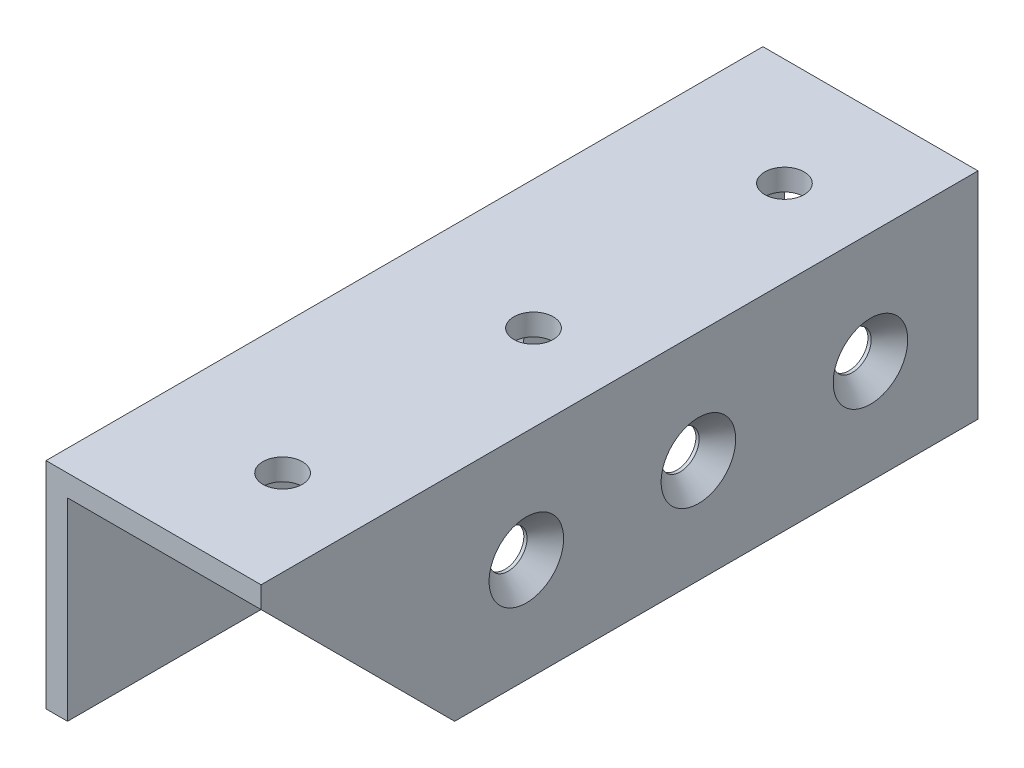
ISO-10303-21;
HEADER;
FILE_DESCRIPTION(('STEP AP214'),'2;1');
FILE_NAME('part.step','',(''),(''),'','','');
FILE_SCHEMA(('AUTOMOTIVE_DESIGN { 1 0 10303 214 1 1 1 1 }'));
ENDSEC;
DATA;
#1=APPLICATION_CONTEXT('core data for automotive mechanical design processes');
#2=APPLICATION_PROTOCOL_DEFINITION('international standard','automotive_design',2000,#1);
#3=PRODUCT_CONTEXT('',#1,'mechanical');
#4=PRODUCT('Part','Part','',(#3));
#5=PRODUCT_RELATED_PRODUCT_CATEGORY('part','',(#4));
#6=PRODUCT_DEFINITION_FORMATION('','',#4);
#7=PRODUCT_DEFINITION_CONTEXT('part definition',#1,'design');
#8=PRODUCT_DEFINITION('design','',#6,#7);
#9=PRODUCT_DEFINITION_SHAPE('','',#8);
#10=(LENGTH_UNIT() NAMED_UNIT(*) SI_UNIT(.MILLI.,.METRE.));
#11=(NAMED_UNIT(*) PLANE_ANGLE_UNIT() SI_UNIT($,.RADIAN.));
#12=(NAMED_UNIT(*) SI_UNIT($,.STERADIAN.) SOLID_ANGLE_UNIT());
#13=UNCERTAINTY_MEASURE_WITH_UNIT(LENGTH_MEASURE(1.E-05),#10,'distance_accuracy_value','');
#14=(GEOMETRIC_REPRESENTATION_CONTEXT(3) GLOBAL_UNCERTAINTY_ASSIGNED_CONTEXT((#13)) GLOBAL_UNIT_ASSIGNED_CONTEXT((#10,
#11,#12)) REPRESENTATION_CONTEXT('',''));
#15=CARTESIAN_POINT('',(0.,0.,0.));
#16=DIRECTION('',(0.,0.,1.));
#17=DIRECTION('',(1.,0.,0.));
#18=AXIS2_PLACEMENT_3D('',#15,#16,#17);
#19=CARTESIAN_POINT('',(3.,0.,100.));
#20=DIRECTION('',(0.,1.,0.));
#21=DIRECTION('',(-1.,0.,0.));
#22=AXIS2_PLACEMENT_3D('',#19,#20,#21);
#23=PLANE('',#22);
#24=DIRECTION('',(1.,0.,0.));
#25=VECTOR('',#24,1.);
#26=CARTESIAN_POINT('',(3.,0.,0.));
#27=LINE('',#26,#25);
#28=CARTESIAN_POINT('',(0.,0.,0.));
#29=VERTEX_POINT('',#28);
#30=CARTESIAN_POINT('',(3.,0.,0.));
#31=VERTEX_POINT('',#30);
#32=EDGE_CURVE('E136',#29,#31,#27,.T.);
#33=ORIENTED_EDGE('',*,*,#32,.T.);
#34=DIRECTION('',(0.,0.,-1.));
#35=VECTOR('',#34,1.);
#36=CARTESIAN_POINT('',(3.,0.,100.));
#37=LINE('',#36,#35);
#38=CARTESIAN_POINT('',(3.,0.,100.));
#39=VERTEX_POINT('',#38);
#40=EDGE_CURVE('E116',#39,#31,#37,.T.);
#41=ORIENTED_EDGE('',*,*,#40,.F.);
#42=DIRECTION('',(1.,0.,0.));
#43=VECTOR('',#42,1.);
#44=CARTESIAN_POINT('',(3.,0.,100.));
#45=LINE('',#44,#43);
#46=CARTESIAN_POINT('',(0.,0.,100.));
#47=VERTEX_POINT('',#46);
#48=EDGE_CURVE('E124',#47,#39,#45,.T.);
#49=ORIENTED_EDGE('',*,*,#48,.F.);
#50=DIRECTION('',(0.,0.,-1.));
#51=VECTOR('',#50,1.);
#52=CARTESIAN_POINT('',(0.,0.,100.));
#53=LINE('',#52,#51);
#54=EDGE_CURVE('E157',#47,#29,#53,.T.);
#55=ORIENTED_EDGE('',*,*,#54,.T.);
#56=EDGE_LOOP('',(#33,#41,#49,#55));
#57=FACE_BOUND('',#56,.T.);
#58=ADVANCED_FACE('F45',(#57),#23,.F.);
#59=CARTESIAN_POINT('',(3.,27.,100.));
#60=DIRECTION('',(-1.,0.,0.));
#61=DIRECTION('',(0.,-1.,0.));
#62=AXIS2_PLACEMENT_3D('',#59,#60,#61);
#63=PLANE('',#62);
#64=CARTESIAN_POINT('',(3.,14.5,15.));
#65=DIRECTION('',(-1.,0.,0.));
#66=DIRECTION('',(0.,-1.,0.));
#67=AXIS2_PLACEMENT_3D('',#64,#65,#66);
#68=CIRCLE('',#67,2.64999999999999);
#69=CARTESIAN_POINT('',(3.,11.85,15.));
#70=VERTEX_POINT('',#69);
#71=EDGE_CURVE('E229',#70,#70,#68,.T.);
#72=ORIENTED_EDGE('',*,*,#71,.T.);
#73=EDGE_LOOP('',(#72));
#74=FACE_BOUND('',#73,.T.);
#75=CARTESIAN_POINT('',(3.,14.5,63.));
#76=DIRECTION('',(-1.,0.,0.));
#77=DIRECTION('',(0.,-1.,0.));
#78=AXIS2_PLACEMENT_3D('',#75,#76,#77);
#79=CIRCLE('',#78,2.64999999999999);
#80=CARTESIAN_POINT('',(3.,11.85,63.));
#81=VERTEX_POINT('',#80);
#82=EDGE_CURVE('E214',#81,#81,#79,.T.);
#83=ORIENTED_EDGE('',*,*,#82,.T.);
#84=EDGE_LOOP('',(#83));
#85=FACE_BOUND('',#84,.T.);
#86=CARTESIAN_POINT('',(3.,14.5,39.));
#87=DIRECTION('',(-1.,0.,0.));
#88=DIRECTION('',(0.,-1.,0.));
#89=AXIS2_PLACEMENT_3D('',#86,#87,#88);
#90=CIRCLE('',#89,2.64999999999999);
#91=CARTESIAN_POINT('',(3.,11.85,39.));
#92=VERTEX_POINT('',#91);
#93=EDGE_CURVE('E199',#92,#92,#90,.T.);
#94=ORIENTED_EDGE('',*,*,#93,.T.);
#95=EDGE_LOOP('',(#94));
#96=FACE_BOUND('',#95,.T.);
#97=DIRECTION('',(0.,1.,0.));
#98=VECTOR('',#97,1.);
#99=CARTESIAN_POINT('',(3.,27.,0.));
#100=LINE('',#99,#98);
#101=CARTESIAN_POINT('',(3.,27.,0.));
#102=VERTEX_POINT('',#101);
#103=EDGE_CURVE('E172',#31,#102,#100,.T.);
#104=ORIENTED_EDGE('',*,*,#103,.T.);
#105=DIRECTION('',(0.,0.,-1.));
#106=VECTOR('',#105,1.);
#107=CARTESIAN_POINT('',(3.,27.,100.));
#108=LINE('',#107,#106);
#109=CARTESIAN_POINT('',(3.,27.,100.));
#110=VERTEX_POINT('',#109);
#111=EDGE_CURVE('E119',#110,#102,#108,.T.);
#112=ORIENTED_EDGE('',*,*,#111,.F.);
#113=DIRECTION('',(0.,1.,0.));
#114=VECTOR('',#113,1.);
#115=CARTESIAN_POINT('',(3.,27.,100.));
#116=LINE('',#115,#114);
#117=EDGE_CURVE('E112',#39,#110,#116,.T.);
#118=ORIENTED_EDGE('',*,*,#117,.F.);
#119=ORIENTED_EDGE('',*,*,#40,.T.);
#120=EDGE_LOOP('',(#104,#112,#118,#119));
#121=FACE_BOUND('',#120,.T.);
#122=ADVANCED_FACE('F114',(#74,#85,#96,#121),#63,.F.);
#123=CARTESIAN_POINT('',(27.,27.,100.));
#124=DIRECTION('',(0.,1.,0.));
#125=DIRECTION('',(-1.,0.,0.));
#126=AXIS2_PLACEMENT_3D('',#123,#124,#125);
#127=PLANE('',#126);
#128=CARTESIAN_POINT('',(18.,27.,50.));
#129=DIRECTION('',(0.,1.,0.));
#130=DIRECTION('',(-1.,0.,0.));
#131=AXIS2_PLACEMENT_3D('',#128,#129,#130);
#132=CIRCLE('',#131,2.74999999999999);
#133=CARTESIAN_POINT('',(15.25,27.,50.));
#134=VERTEX_POINT('',#133);
#135=EDGE_CURVE('E193',#134,#134,#132,.T.);
#136=ORIENTED_EDGE('',*,*,#135,.T.);
#137=EDGE_LOOP('',(#136));
#138=FACE_BOUND('',#137,.T.);
#139=CARTESIAN_POINT('',(18.,27.,15.));
#140=DIRECTION('',(0.,1.,0.));
#141=DIRECTION('',(-1.,0.,0.));
#142=AXIS2_PLACEMENT_3D('',#139,#140,#141);
#143=CIRCLE('',#142,2.74999999999999);
#144=CARTESIAN_POINT('',(15.25,27.,15.));
#145=VERTEX_POINT('',#144);
#146=EDGE_CURVE('E187',#145,#145,#143,.T.);
#147=ORIENTED_EDGE('',*,*,#146,.T.);
#148=EDGE_LOOP('',(#147));
#149=FACE_BOUND('',#148,.T.);
#150=CARTESIAN_POINT('',(18.,27.,85.));
#151=DIRECTION('',(0.,1.,0.));
#152=DIRECTION('',(-1.,0.,0.));
#153=AXIS2_PLACEMENT_3D('',#150,#151,#152);
#154=CIRCLE('',#153,2.74999999999999);
#155=CARTESIAN_POINT('',(15.25,27.,85.));
#156=VERTEX_POINT('',#155);
#157=EDGE_CURVE('E175',#156,#156,#154,.T.);
#158=ORIENTED_EDGE('',*,*,#157,.T.);
#159=EDGE_LOOP('',(#158));
#160=FACE_BOUND('',#159,.T.);
#161=DIRECTION('',(1.,0.,0.));
#162=VECTOR('',#161,1.);
#163=CARTESIAN_POINT('',(27.,27.,0.));
#164=LINE('',#163,#162);
#165=CARTESIAN_POINT('',(27.,27.,0.));
#166=VERTEX_POINT('',#165);
#167=EDGE_CURVE('E170',#102,#166,#164,.T.);
#168=ORIENTED_EDGE('',*,*,#167,.T.);
#169=DIRECTION('',(0.,0.,-1.));
#170=VECTOR('',#169,1.);
#171=CARTESIAN_POINT('',(27.,27.,100.));
#172=LINE('',#171,#170);
#173=CARTESIAN_POINT('',(27.,27.,100.));
#174=VERTEX_POINT('',#173);
#175=EDGE_CURVE('E141',#174,#166,#172,.T.);
#176=ORIENTED_EDGE('',*,*,#175,.F.);
#177=DIRECTION('',(1.,0.,0.));
#178=VECTOR('',#177,1.);
#179=CARTESIAN_POINT('',(27.,27.,100.));
#180=LINE('',#179,#178);
#181=EDGE_CURVE('E123',#110,#174,#180,.T.);
#182=ORIENTED_EDGE('',*,*,#181,.F.);
#183=ORIENTED_EDGE('',*,*,#111,.T.);
#184=EDGE_LOOP('',(#168,#176,#182,#183));
#185=FACE_BOUND('',#184,.T.);
#186=ADVANCED_FACE('F277',(#138,#149,#160,#185),#127,.F.);
#187=CARTESIAN_POINT('',(27.,0.,100.));
#188=DIRECTION('',(1.,0.,0.));
#189=DIRECTION('',(0.,0.,-1.));
#190=AXIS2_PLACEMENT_3D('',#187,#188,#189);
#191=PLANE('',#190);
#192=CARTESIAN_POINT('',(27.,14.5,15.));
#193=DIRECTION('',(1.,0.,0.));
#194=DIRECTION('',(0.,0.,-1.));
#195=AXIS2_PLACEMENT_3D('',#192,#193,#194);
#196=CIRCLE('',#195,2.64999999999999);
#197=CARTESIAN_POINT('',(27.,14.5,12.35));
#198=VERTEX_POINT('',#197);
#199=EDGE_CURVE('E232',#198,#198,#196,.T.);
#200=ORIENTED_EDGE('',*,*,#199,.T.);
#201=EDGE_LOOP('',(#200));
#202=FACE_BOUND('',#201,.T.);
#203=CARTESIAN_POINT('',(27.,14.5,63.));
#204=DIRECTION('',(1.,0.,0.));
#205=DIRECTION('',(0.,0.,-1.));
#206=AXIS2_PLACEMENT_3D('',#203,#204,#205);
#207=CIRCLE('',#206,2.64999999999999);
#208=CARTESIAN_POINT('',(27.,14.5,60.35));
#209=VERTEX_POINT('',#208);
#210=EDGE_CURVE('E217',#209,#209,#207,.T.);
#211=ORIENTED_EDGE('',*,*,#210,.T.);
#212=EDGE_LOOP('',(#211));
#213=FACE_BOUND('',#212,.T.);
#214=CARTESIAN_POINT('',(27.,14.5,39.));
#215=DIRECTION('',(1.,0.,0.));
#216=DIRECTION('',(0.,0.,-1.));
#217=AXIS2_PLACEMENT_3D('',#214,#215,#216);
#218=CIRCLE('',#217,2.64999999999999);
#219=CARTESIAN_POINT('',(27.,14.5,36.35));
#220=VERTEX_POINT('',#219);
#221=EDGE_CURVE('E202',#220,#220,#218,.T.);
#222=ORIENTED_EDGE('',*,*,#221,.T.);
#223=EDGE_LOOP('',(#222));
#224=FACE_BOUND('',#223,.T.);
#225=DIRECTION('',(0.,0.,-1.));
#226=VECTOR('',#225,1.);
#227=CARTESIAN_POINT('',(27.,0.,100.));
#228=LINE('',#227,#226);
#229=CARTESIAN_POINT('',(27.,0.,72.9999999999999));
#230=VERTEX_POINT('',#229);
#231=CARTESIAN_POINT('',(27.,0.,0.));
#232=VERTEX_POINT('',#231);
#233=EDGE_CURVE('E147',#230,#232,#228,.T.);
#234=ORIENTED_EDGE('',*,*,#233,.F.);
#235=DIRECTION('',(0.,-0.707106781186546,-0.707106781186549));
#236=VECTOR('',#235,1.);
#237=CARTESIAN_POINT('',(27.,27.,100.));
#238=LINE('',#237,#236);
#239=EDGE_CURVE('E11',#230,#174,#238,.F.);
#240=ORIENTED_EDGE('',*,*,#239,.T.);
#241=ORIENTED_EDGE('',*,*,#175,.T.);
#242=DIRECTION('',(0.,-1.,0.));
#243=VECTOR('',#242,1.);
#244=CARTESIAN_POINT('',(27.,0.,0.));
#245=LINE('',#244,#243);
#246=EDGE_CURVE('E167',#166,#232,#245,.T.);
#247=ORIENTED_EDGE('',*,*,#246,.T.);
#248=EDGE_LOOP('',(#234,#240,#241,#247));
#249=FACE_BOUND('',#248,.T.);
#250=ADVANCED_FACE('F264',(#202,#213,#224,#249),#191,.F.);
#251=CARTESIAN_POINT('',(30.,0.,100.));
#252=DIRECTION('',(0.,1.,0.));
#253=DIRECTION('',(-1.,0.,0.));
#254=AXIS2_PLACEMENT_3D('',#251,#252,#253);
#255=PLANE('',#254);
#256=DIRECTION('',(0.,0.,-1.));
#257=VECTOR('',#256,1.);
#258=CARTESIAN_POINT('',(30.,0.,100.));
#259=LINE('',#258,#257);
#260=CARTESIAN_POINT('',(30.,0.,72.9999999999999));
#261=VERTEX_POINT('',#260);
#262=CARTESIAN_POINT('',(30.,0.,0.));
#263=VERTEX_POINT('',#262);
#264=EDGE_CURVE('E149',#261,#263,#259,.T.);
#265=ORIENTED_EDGE('',*,*,#264,.F.);
#266=DIRECTION('',(-1.,0.,0.));
#267=VECTOR('',#266,1.);
#268=CARTESIAN_POINT('',(30.,0.,72.9999999999999));
#269=LINE('',#268,#267);
#270=EDGE_CURVE('E54',#261,#230,#269,.T.);
#271=ORIENTED_EDGE('',*,*,#270,.T.);
#272=ORIENTED_EDGE('',*,*,#233,.T.);
#273=DIRECTION('',(1.,0.,0.));
#274=VECTOR('',#273,1.);
#275=CARTESIAN_POINT('',(30.,0.,0.));
#276=LINE('',#275,#274);
#277=EDGE_CURVE('E164',#232,#263,#276,.T.);
#278=ORIENTED_EDGE('',*,*,#277,.T.);
#279=EDGE_LOOP('',(#265,#271,#272,#278));
#280=FACE_BOUND('',#279,.T.);
#281=ADVANCED_FACE('F251',(#280),#255,.F.);
#282=CARTESIAN_POINT('',(30.,30.,100.));
#283=DIRECTION('',(-1.,0.,0.));
#284=DIRECTION('',(0.,-1.,0.));
#285=AXIS2_PLACEMENT_3D('',#282,#283,#284);
#286=PLANE('',#285);
#287=CARTESIAN_POINT('',(30.,14.5,15.));
#288=DIRECTION('',(1.,0.,0.));
#289=DIRECTION('',(0.,0.,-1.));
#290=AXIS2_PLACEMENT_3D('',#287,#288,#289);
#291=CIRCLE('',#290,5.2);
#292=CARTESIAN_POINT('',(30.,14.5,9.8));
#293=VERTEX_POINT('',#292);
#294=EDGE_CURVE('E241',#293,#293,#291,.T.);
#295=ORIENTED_EDGE('',*,*,#294,.F.);
#296=EDGE_LOOP('',(#295));
#297=FACE_BOUND('',#296,.T.);
#298=CARTESIAN_POINT('',(30.,14.5,63.));
#299=DIRECTION('',(1.,0.,0.));
#300=DIRECTION('',(0.,0.,-1.));
#301=AXIS2_PLACEMENT_3D('',#298,#299,#300);
#302=CIRCLE('',#301,5.2);
#303=CARTESIAN_POINT('',(30.,14.5,57.8));
#304=VERTEX_POINT('',#303);
#305=EDGE_CURVE('E226',#304,#304,#302,.T.);
#306=ORIENTED_EDGE('',*,*,#305,.F.);
#307=EDGE_LOOP('',(#306));
#308=FACE_BOUND('',#307,.T.);
#309=CARTESIAN_POINT('',(30.,14.5,39.));
#310=DIRECTION('',(1.,0.,0.));
#311=DIRECTION('',(0.,0.,-1.));
#312=AXIS2_PLACEMENT_3D('',#309,#310,#311);
#313=CIRCLE('',#312,5.2);
#314=CARTESIAN_POINT('',(30.,14.5,33.8));
#315=VERTEX_POINT('',#314);
#316=EDGE_CURVE('E211',#315,#315,#313,.T.);
#317=ORIENTED_EDGE('',*,*,#316,.F.);
#318=EDGE_LOOP('',(#317));
#319=FACE_BOUND('',#318,.T.);
#320=DIRECTION('',(0.,1.,0.));
#321=VECTOR('',#320,1.);
#322=CARTESIAN_POINT('',(30.,30.,100.));
#323=LINE('',#322,#321);
#324=CARTESIAN_POINT('',(30.,27.,100.));
#325=VERTEX_POINT('',#324);
#326=CARTESIAN_POINT('',(30.,30.,100.));
#327=VERTEX_POINT('',#326);
#328=EDGE_CURVE('E179',#325,#327,#323,.T.);
#329=ORIENTED_EDGE('',*,*,#328,.F.);
#330=DIRECTION('',(0.,0.707106781186546,0.707106781186549));
#331=VECTOR('',#330,1.);
#332=CARTESIAN_POINT('',(30.,27.,100.));
#333=LINE('',#332,#331);
#334=EDGE_CURVE('E68',#325,#261,#333,.F.);
#335=ORIENTED_EDGE('',*,*,#334,.T.);
#336=ORIENTED_EDGE('',*,*,#264,.T.);
#337=DIRECTION('',(0.,1.,0.));
#338=VECTOR('',#337,1.);
#339=CARTESIAN_POINT('',(30.,30.,0.));
#340=LINE('',#339,#338);
#341=CARTESIAN_POINT('',(30.,30.,0.));
#342=VERTEX_POINT('',#341);
#343=EDGE_CURVE('E162',#263,#342,#340,.T.);
#344=ORIENTED_EDGE('',*,*,#343,.T.);
#345=DIRECTION('',(0.,0.,-1.));
#346=VECTOR('',#345,1.);
#347=CARTESIAN_POINT('',(30.,30.,100.));
#348=LINE('',#347,#346);
#349=EDGE_CURVE('E151',#327,#342,#348,.T.);
#350=ORIENTED_EDGE('',*,*,#349,.F.);
#351=EDGE_LOOP('',(#329,#335,#336,#344,#350));
#352=FACE_BOUND('',#351,.T.);
#353=ADVANCED_FACE('F247',(#297,#308,#319,#352),#286,.F.);
#354=CARTESIAN_POINT('',(0.,30.,100.));
#355=DIRECTION('',(0.,-1.,0.));
#356=DIRECTION('',(0.,0.,-1.));
#357=AXIS2_PLACEMENT_3D('',#354,#355,#356);
#358=PLANE('',#357);
#359=CARTESIAN_POINT('',(18.,30.,50.));
#360=DIRECTION('',(0.,1.,0.));
#361=DIRECTION('',(0.,0.,1.));
#362=AXIS2_PLACEMENT_3D('',#359,#360,#361);
#363=CIRCLE('',#362,2.74999999999999);
#364=CARTESIAN_POINT('',(18.,30.,52.75));
#365=VERTEX_POINT('',#364);
#366=EDGE_CURVE('E196',#365,#365,#363,.T.);
#367=ORIENTED_EDGE('',*,*,#366,.F.);
#368=EDGE_LOOP('',(#367));
#369=FACE_BOUND('',#368,.T.);
#370=CARTESIAN_POINT('',(18.,30.,15.));
#371=DIRECTION('',(0.,1.,0.));
#372=DIRECTION('',(0.,0.,1.));
#373=AXIS2_PLACEMENT_3D('',#370,#371,#372);
#374=CIRCLE('',#373,2.74999999999999);
#375=CARTESIAN_POINT('',(18.,30.,17.75));
#376=VERTEX_POINT('',#375);
#377=EDGE_CURVE('E190',#376,#376,#374,.T.);
#378=ORIENTED_EDGE('',*,*,#377,.F.);
#379=EDGE_LOOP('',(#378));
#380=FACE_BOUND('',#379,.T.);
#381=CARTESIAN_POINT('',(18.,30.,85.));
#382=DIRECTION('',(0.,1.,0.));
#383=DIRECTION('',(0.,0.,1.));
#384=AXIS2_PLACEMENT_3D('',#381,#382,#383);
#385=CIRCLE('',#384,2.74999999999999);
#386=CARTESIAN_POINT('',(18.,30.,87.75));
#387=VERTEX_POINT('',#386);
#388=EDGE_CURVE('E184',#387,#387,#385,.T.);
#389=ORIENTED_EDGE('',*,*,#388,.F.);
#390=EDGE_LOOP('',(#389));
#391=FACE_BOUND('',#390,.T.);
#392=DIRECTION('',(-1.,0.,0.));
#393=VECTOR('',#392,1.);
#394=CARTESIAN_POINT('',(0.,30.,0.));
#395=LINE('',#394,#393);
#396=CARTESIAN_POINT('',(0.,30.,0.));
#397=VERTEX_POINT('',#396);
#398=EDGE_CURVE('E160',#342,#397,#395,.T.);
#399=ORIENTED_EDGE('',*,*,#398,.T.);
#400=DIRECTION('',(0.,0.,-1.));
#401=VECTOR('',#400,1.);
#402=CARTESIAN_POINT('',(0.,30.,100.));
#403=LINE('',#402,#401);
#404=CARTESIAN_POINT('',(0.,30.,100.));
#405=VERTEX_POINT('',#404);
#406=EDGE_CURVE('E154',#405,#397,#403,.T.);
#407=ORIENTED_EDGE('',*,*,#406,.F.);
#408=DIRECTION('',(-1.,0.,0.));
#409=VECTOR('',#408,1.);
#410=CARTESIAN_POINT('',(0.,30.,100.));
#411=LINE('',#410,#409);
#412=EDGE_CURVE('E177',#327,#405,#411,.T.);
#413=ORIENTED_EDGE('',*,*,#412,.F.);
#414=ORIENTED_EDGE('',*,*,#349,.T.);
#415=EDGE_LOOP('',(#399,#407,#413,#414));
#416=FACE_BOUND('',#415,.T.);
#417=ADVANCED_FACE('F250',(#369,#380,#391,#416),#358,.F.);
#418=CARTESIAN_POINT('',(0.,0.,100.));
#419=DIRECTION('',(1.,0.,0.));
#420=DIRECTION('',(0.,0.,-1.));
#421=AXIS2_PLACEMENT_3D('',#418,#419,#420);
#422=PLANE('',#421);
#423=CARTESIAN_POINT('',(0.,14.5,15.));
#424=DIRECTION('',(1.,0.,0.));
#425=DIRECTION('',(0.,0.,-1.));
#426=AXIS2_PLACEMENT_3D('',#423,#424,#425);
#427=CIRCLE('',#426,2.64999999999999);
#428=CARTESIAN_POINT('',(0.,14.5,12.35));
#429=VERTEX_POINT('',#428);
#430=EDGE_CURVE('E235',#429,#429,#427,.T.);
#431=ORIENTED_EDGE('',*,*,#430,.T.);
#432=EDGE_LOOP('',(#431));
#433=FACE_BOUND('',#432,.T.);
#434=CARTESIAN_POINT('',(0.,14.5,63.));
#435=DIRECTION('',(1.,0.,0.));
#436=DIRECTION('',(0.,0.,-1.));
#437=AXIS2_PLACEMENT_3D('',#434,#435,#436);
#438=CIRCLE('',#437,2.64999999999999);
#439=CARTESIAN_POINT('',(0.,14.5,60.35));
#440=VERTEX_POINT('',#439);
#441=EDGE_CURVE('E220',#440,#440,#438,.T.);
#442=ORIENTED_EDGE('',*,*,#441,.T.);
#443=EDGE_LOOP('',(#442));
#444=FACE_BOUND('',#443,.T.);
#445=CARTESIAN_POINT('',(0.,14.5,39.));
#446=DIRECTION('',(1.,0.,0.));
#447=DIRECTION('',(0.,0.,-1.));
#448=AXIS2_PLACEMENT_3D('',#445,#446,#447);
#449=CIRCLE('',#448,2.64999999999999);
#450=CARTESIAN_POINT('',(0.,14.5,36.35));
#451=VERTEX_POINT('',#450);
#452=EDGE_CURVE('E205',#451,#451,#449,.T.);
#453=ORIENTED_EDGE('',*,*,#452,.T.);
#454=EDGE_LOOP('',(#453));
#455=FACE_BOUND('',#454,.T.);
#456=DIRECTION('',(0.,-1.,0.));
#457=VECTOR('',#456,1.);
#458=CARTESIAN_POINT('',(0.,0.,0.));
#459=LINE('',#458,#457);
#460=EDGE_CURVE('E133',#397,#29,#459,.T.);
#461=ORIENTED_EDGE('',*,*,#460,.T.);
#462=ORIENTED_EDGE('',*,*,#54,.F.);
#463=DIRECTION('',(0.,-1.,0.));
#464=VECTOR('',#463,1.);
#465=CARTESIAN_POINT('',(0.,0.,100.));
#466=LINE('',#465,#464);
#467=EDGE_CURVE('E129',#405,#47,#466,.T.);
#468=ORIENTED_EDGE('',*,*,#467,.F.);
#469=ORIENTED_EDGE('',*,*,#406,.T.);
#470=EDGE_LOOP('',(#461,#462,#468,#469));
#471=FACE_BOUND('',#470,.T.);
#472=ADVANCED_FACE('F274',(#433,#444,#455,#471),#422,.F.);
#473=CARTESIAN_POINT('',(0.,0.,100.));
#474=DIRECTION('',(0.,0.,-1.));
#475=DIRECTION('',(-1.,0.,0.));
#476=AXIS2_PLACEMENT_3D('',#473,#474,#475);
#477=PLANE('',#476);
#478=ORIENTED_EDGE('',*,*,#181,.T.);
#479=DIRECTION('',(1.,0.,0.));
#480=VECTOR('',#479,1.);
#481=CARTESIAN_POINT('',(0.,27.,100.));
#482=LINE('',#481,#480);
#483=EDGE_CURVE('E137',#174,#325,#482,.T.);
#484=ORIENTED_EDGE('',*,*,#483,.T.);
#485=ORIENTED_EDGE('',*,*,#328,.T.);
#486=ORIENTED_EDGE('',*,*,#412,.T.);
#487=ORIENTED_EDGE('',*,*,#467,.T.);
#488=ORIENTED_EDGE('',*,*,#48,.T.);
#489=ORIENTED_EDGE('',*,*,#117,.T.);
#490=EDGE_LOOP('',(#478,#484,#485,#486,#487,#488,#489));
#491=FACE_BOUND('',#490,.T.);
#492=ADVANCED_FACE('F127',(#491),#477,.F.);
#493=CARTESIAN_POINT('',(0.,0.,0.));
#494=DIRECTION('',(0.,0.,-1.));
#495=DIRECTION('',(-1.,0.,0.));
#496=AXIS2_PLACEMENT_3D('',#493,#494,#495);
#497=PLANE('',#496);
#498=ORIENTED_EDGE('',*,*,#32,.F.);
#499=ORIENTED_EDGE('',*,*,#460,.F.);
#500=ORIENTED_EDGE('',*,*,#398,.F.);
#501=ORIENTED_EDGE('',*,*,#343,.F.);
#502=ORIENTED_EDGE('',*,*,#277,.F.);
#503=ORIENTED_EDGE('',*,*,#246,.F.);
#504=ORIENTED_EDGE('',*,*,#167,.F.);
#505=ORIENTED_EDGE('',*,*,#103,.F.);
#506=EDGE_LOOP('',(#498,#499,#500,#501,#502,#503,#504,#505));
#507=FACE_BOUND('',#506,.T.);
#508=ADVANCED_FACE('F270',(#507),#497,.T.);
#509=CARTESIAN_POINT('',(18.,30.,85.));
#510=DIRECTION('',(0.,1.,0.));
#511=DIRECTION('',(0.,0.,1.));
#512=AXIS2_PLACEMENT_3D('',#509,#510,#511);
#513=CYLINDRICAL_SURFACE('',#512,2.74999999999999);
#514=ORIENTED_EDGE('',*,*,#388,.T.);
#515=EDGE_LOOP('',(#514));
#516=FACE_BOUND('',#515,.T.);
#517=ORIENTED_EDGE('',*,*,#157,.F.);
#518=EDGE_LOOP('',(#517));
#519=FACE_BOUND('',#518,.T.);
#520=ADVANCED_FACE('F301',(#516,#519),#513,.F.);
#521=CARTESIAN_POINT('',(18.,30.,15.));
#522=DIRECTION('',(0.,1.,0.));
#523=DIRECTION('',(0.,0.,1.));
#524=AXIS2_PLACEMENT_3D('',#521,#522,#523);
#525=CYLINDRICAL_SURFACE('',#524,2.74999999999999);
#526=ORIENTED_EDGE('',*,*,#377,.T.);
#527=EDGE_LOOP('',(#526));
#528=FACE_BOUND('',#527,.T.);
#529=ORIENTED_EDGE('',*,*,#146,.F.);
#530=EDGE_LOOP('',(#529));
#531=FACE_BOUND('',#530,.T.);
#532=ADVANCED_FACE('F318',(#528,#531),#525,.F.);
#533=CARTESIAN_POINT('',(18.,30.,50.));
#534=DIRECTION('',(0.,1.,0.));
#535=DIRECTION('',(0.,0.,1.));
#536=AXIS2_PLACEMENT_3D('',#533,#534,#535);
#537=CYLINDRICAL_SURFACE('',#536,2.74999999999999);
#538=ORIENTED_EDGE('',*,*,#366,.T.);
#539=EDGE_LOOP('',(#538));
#540=FACE_BOUND('',#539,.T.);
#541=ORIENTED_EDGE('',*,*,#135,.F.);
#542=EDGE_LOOP('',(#541));
#543=FACE_BOUND('',#542,.T.);
#544=ADVANCED_FACE('F326',(#540,#543),#537,.F.);
#545=CARTESIAN_POINT('',(30.,14.5,39.));
#546=DIRECTION('',(1.,0.,0.));
#547=DIRECTION('',(0.,0.,-1.));
#548=AXIS2_PLACEMENT_3D('',#545,#546,#547);
#549=CYLINDRICAL_SURFACE('',#548,2.64999999999999);
#550=ORIENTED_EDGE('',*,*,#452,.F.);
#551=EDGE_LOOP('',(#550));
#552=FACE_BOUND('',#551,.T.);
#553=ORIENTED_EDGE('',*,*,#93,.F.);
#554=EDGE_LOOP('',(#553));
#555=FACE_BOUND('',#554,.T.);
#556=ADVANCED_FACE('F333',(#552,#555),#549,.F.);
#557=CARTESIAN_POINT('',(27.45,14.5,39.));
#558=DIRECTION('',(1.,0.,0.));
#559=DIRECTION('',(0.,0.,-1.));
#560=AXIS2_PLACEMENT_3D('',#557,#558,#559);
#561=CIRCLE('',#560,2.65);
#562=CARTESIAN_POINT('',(27.45,14.5,36.35));
#563=VERTEX_POINT('',#562);
#564=EDGE_CURVE('E208',#563,#563,#561,.T.);
#565=ORIENTED_EDGE('',*,*,#564,.T.);
#566=EDGE_LOOP('',(#565));
#567=FACE_BOUND('',#566,.T.);
#568=ORIENTED_EDGE('',*,*,#221,.F.);
#569=EDGE_LOOP('',(#568));
#570=FACE_BOUND('',#569,.T.);
#571=ADVANCED_FACE('F351',(#567,#570),#549,.F.);
#572=CARTESIAN_POINT('',(30.,14.5,39.));
#573=DIRECTION('',(1.,0.,0.));
#574=DIRECTION('',(0.,0.,-1.));
#575=AXIS2_PLACEMENT_3D('',#572,#573,#574);
#576=CONICAL_SURFACE('',#575,5.2,0.785398163397448);
#577=ORIENTED_EDGE('',*,*,#564,.F.);
#578=EDGE_LOOP('',(#577));
#579=FACE_BOUND('',#578,.T.);
#580=ORIENTED_EDGE('',*,*,#316,.T.);
#581=EDGE_LOOP('',(#580));
#582=FACE_BOUND('',#581,.T.);
#583=ADVANCED_FACE('F359',(#579,#582),#576,.F.);
#584=CARTESIAN_POINT('',(30.,14.5,63.));
#585=DIRECTION('',(1.,0.,0.));
#586=DIRECTION('',(0.,0.,-1.));
#587=AXIS2_PLACEMENT_3D('',#584,#585,#586);
#588=CYLINDRICAL_SURFACE('',#587,2.64999999999999);
#589=ORIENTED_EDGE('',*,*,#441,.F.);
#590=EDGE_LOOP('',(#589));
#591=FACE_BOUND('',#590,.T.);
#592=ORIENTED_EDGE('',*,*,#82,.F.);
#593=EDGE_LOOP('',(#592));
#594=FACE_BOUND('',#593,.T.);
#595=ADVANCED_FACE('F366',(#591,#594),#588,.F.);
#596=CARTESIAN_POINT('',(27.45,14.5,63.));
#597=DIRECTION('',(1.,0.,0.));
#598=DIRECTION('',(0.,0.,-1.));
#599=AXIS2_PLACEMENT_3D('',#596,#597,#598);
#600=CIRCLE('',#599,2.65);
#601=CARTESIAN_POINT('',(27.45,14.5,60.35));
#602=VERTEX_POINT('',#601);
#603=EDGE_CURVE('E223',#602,#602,#600,.T.);
#604=ORIENTED_EDGE('',*,*,#603,.T.);
#605=EDGE_LOOP('',(#604));
#606=FACE_BOUND('',#605,.T.);
#607=ORIENTED_EDGE('',*,*,#210,.F.);
#608=EDGE_LOOP('',(#607));
#609=FACE_BOUND('',#608,.T.);
#610=ADVANCED_FACE('F374',(#606,#609),#588,.F.);
#611=CARTESIAN_POINT('',(30.,14.5,63.));
#612=DIRECTION('',(1.,0.,0.));
#613=DIRECTION('',(0.,0.,-1.));
#614=AXIS2_PLACEMENT_3D('',#611,#612,#613);
#615=CONICAL_SURFACE('',#614,5.2,0.785398163397448);
#616=ORIENTED_EDGE('',*,*,#603,.F.);
#617=EDGE_LOOP('',(#616));
#618=FACE_BOUND('',#617,.T.);
#619=ORIENTED_EDGE('',*,*,#305,.T.);
#620=EDGE_LOOP('',(#619));
#621=FACE_BOUND('',#620,.T.);
#622=ADVANCED_FACE('F382',(#618,#621),#615,.F.);
#623=CARTESIAN_POINT('',(30.,14.5,15.));
#624=DIRECTION('',(1.,0.,0.));
#625=DIRECTION('',(0.,0.,-1.));
#626=AXIS2_PLACEMENT_3D('',#623,#624,#625);
#627=CYLINDRICAL_SURFACE('',#626,2.64999999999999);
#628=ORIENTED_EDGE('',*,*,#430,.F.);
#629=EDGE_LOOP('',(#628));
#630=FACE_BOUND('',#629,.T.);
#631=ORIENTED_EDGE('',*,*,#71,.F.);
#632=EDGE_LOOP('',(#631));
#633=FACE_BOUND('',#632,.T.);
#634=ADVANCED_FACE('F389',(#630,#633),#627,.F.);
#635=CARTESIAN_POINT('',(27.45,14.5,15.));
#636=DIRECTION('',(1.,0.,0.));
#637=DIRECTION('',(0.,0.,-1.));
#638=AXIS2_PLACEMENT_3D('',#635,#636,#637);
#639=CIRCLE('',#638,2.65);
#640=CARTESIAN_POINT('',(27.45,14.5,12.35));
#641=VERTEX_POINT('',#640);
#642=EDGE_CURVE('E238',#641,#641,#639,.T.);
#643=ORIENTED_EDGE('',*,*,#642,.T.);
#644=EDGE_LOOP('',(#643));
#645=FACE_BOUND('',#644,.T.);
#646=ORIENTED_EDGE('',*,*,#199,.F.);
#647=EDGE_LOOP('',(#646));
#648=FACE_BOUND('',#647,.T.);
#649=ADVANCED_FACE('F397',(#645,#648),#627,.F.);
#650=CARTESIAN_POINT('',(30.,14.5,15.));
#651=DIRECTION('',(1.,0.,0.));
#652=DIRECTION('',(0.,0.,-1.));
#653=AXIS2_PLACEMENT_3D('',#650,#651,#652);
#654=CONICAL_SURFACE('',#653,5.2,0.785398163397448);
#655=ORIENTED_EDGE('',*,*,#642,.F.);
#656=EDGE_LOOP('',(#655));
#657=FACE_BOUND('',#656,.T.);
#658=ORIENTED_EDGE('',*,*,#294,.T.);
#659=EDGE_LOOP('',(#658));
#660=FACE_BOUND('',#659,.T.);
#661=ADVANCED_FACE('F245',(#657,#660),#654,.F.);
#662=CARTESIAN_POINT('',(0.,27.,100.));
#663=DIRECTION('',(0.,0.707106781186549,-0.707106781186546));
#664=DIRECTION('',(1.,0.,0.));
#665=AXIS2_PLACEMENT_3D('',#662,#663,#664);
#666=PLANE('',#665);
#667=ORIENTED_EDGE('',*,*,#239,.F.);
#668=ORIENTED_EDGE('',*,*,#270,.F.);
#669=ORIENTED_EDGE('',*,*,#334,.F.);
#670=ORIENTED_EDGE('',*,*,#483,.F.);
#671=EDGE_LOOP('',(#667,#668,#669,#670));
#672=FACE_BOUND('',#671,.T.);
#673=ADVANCED_FACE('F48',(#672),#666,.F.);
#674=CLOSED_SHELL('',(#58,#122,#186,#250,#281,#353,#417,#472,#492,#508,#520,#532,#544,#556,#571,
#583,#595,#610,#622,#634,#649,#661,#673));
#675=MANIFOLD_SOLID_BREP('B2',#674);
#676=ADVANCED_BREP_SHAPE_REPRESENTATION('',(#18,#675),#14);
#677=SHAPE_DEFINITION_REPRESENTATION(#9,#676);
ENDSEC;
END-ISO-10303-21;
